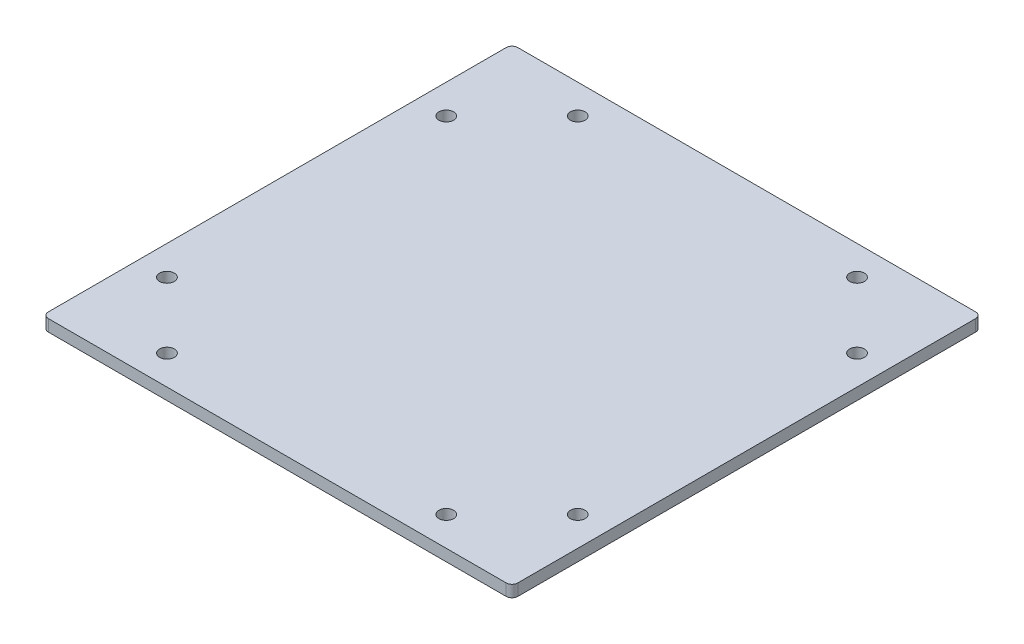
ISO-10303-21;
HEADER;
FILE_DESCRIPTION(('STEP AP214'),'2;1');
FILE_NAME('part.step','',(''),(''),'','','');
FILE_SCHEMA(('AUTOMOTIVE_DESIGN { 1 0 10303 214 1 1 1 1 }'));
ENDSEC;
DATA;
#1=APPLICATION_CONTEXT('core data for automotive mechanical design processes');
#2=APPLICATION_PROTOCOL_DEFINITION('international standard','automotive_design',2000,#1);
#3=PRODUCT_CONTEXT('',#1,'mechanical');
#4=PRODUCT('Part','Part','',(#3));
#5=PRODUCT_RELATED_PRODUCT_CATEGORY('part','',(#4));
#6=PRODUCT_DEFINITION_FORMATION('','',#4);
#7=PRODUCT_DEFINITION_CONTEXT('part definition',#1,'design');
#8=PRODUCT_DEFINITION('design','',#6,#7);
#9=PRODUCT_DEFINITION_SHAPE('','',#8);
#10=(LENGTH_UNIT() NAMED_UNIT(*) SI_UNIT(.MILLI.,.METRE.));
#11=(NAMED_UNIT(*) PLANE_ANGLE_UNIT() SI_UNIT($,.RADIAN.));
#12=(NAMED_UNIT(*) SI_UNIT($,.STERADIAN.) SOLID_ANGLE_UNIT());
#13=UNCERTAINTY_MEASURE_WITH_UNIT(LENGTH_MEASURE(1.E-05),#10,'distance_accuracy_value','');
#14=(GEOMETRIC_REPRESENTATION_CONTEXT(3) GLOBAL_UNCERTAINTY_ASSIGNED_CONTEXT((#13)) GLOBAL_UNIT_ASSIGNED_CONTEXT((#10,
#11,#12)) REPRESENTATION_CONTEXT('',''));
#15=CARTESIAN_POINT('',(0.,0.,0.));
#16=DIRECTION('',(0.,0.,1.));
#17=DIRECTION('',(1.,0.,0.));
#18=AXIS2_PLACEMENT_3D('',#15,#16,#17);
#19=CARTESIAN_POINT('',(-99.06,5.08,-99.06));
#20=DIRECTION('',(0.,-1.,0.));
#21=DIRECTION('',(0.,0.,-1.));
#22=AXIS2_PLACEMENT_3D('',#19,#20,#21);
#23=PLANE('',#22);
#24=CARTESIAN_POINT('',(60.452,5.08,88.9));
#25=DIRECTION('',(0.,1.,0.));
#26=DIRECTION('',(0.,0.,-1.));
#27=AXIS2_PLACEMENT_3D('',#24,#25,#26);
#28=CIRCLE('',#27,3.175);
#29=CARTESIAN_POINT('',(60.452,5.08,85.725));
#30=VERTEX_POINT('',#29);
#31=EDGE_CURVE('E212',#30,#30,#28,.T.);
#32=ORIENTED_EDGE('',*,*,#31,.F.);
#33=EDGE_LOOP('',(#32));
#34=FACE_BOUND('',#33,.T.);
#35=CARTESIAN_POINT('',(-60.452,5.08,-88.9));
#36=DIRECTION('',(0.,1.,0.));
#37=DIRECTION('',(0.,0.,-1.));
#38=AXIS2_PLACEMENT_3D('',#35,#36,#37);
#39=CIRCLE('',#38,3.175);
#40=CARTESIAN_POINT('',(-60.452,5.08,-92.075));
#41=VERTEX_POINT('',#40);
#42=EDGE_CURVE('E200',#41,#41,#39,.T.);
#43=ORIENTED_EDGE('',*,*,#42,.F.);
#44=EDGE_LOOP('',(#43));
#45=FACE_BOUND('',#44,.T.);
#46=CARTESIAN_POINT('',(88.9,5.08,-60.452));
#47=DIRECTION('',(0.,1.,0.));
#48=DIRECTION('',(0.,0.,-1.));
#49=AXIS2_PLACEMENT_3D('',#46,#47,#48);
#50=CIRCLE('',#49,3.175);
#51=CARTESIAN_POINT('',(88.9,5.08,-63.627));
#52=VERTEX_POINT('',#51);
#53=EDGE_CURVE('E188',#52,#52,#50,.T.);
#54=ORIENTED_EDGE('',*,*,#53,.F.);
#55=EDGE_LOOP('',(#54));
#56=FACE_BOUND('',#55,.T.);
#57=CARTESIAN_POINT('',(-60.452,5.08,88.9));
#58=DIRECTION('',(0.,1.,0.));
#59=DIRECTION('',(0.,0.,1.));
#60=AXIS2_PLACEMENT_3D('',#57,#58,#59);
#61=CIRCLE('',#60,3.175);
#62=CARTESIAN_POINT('',(-60.452,5.08,92.075));
#63=VERTEX_POINT('',#62);
#64=EDGE_CURVE('E134',#63,#63,#61,.T.);
#65=ORIENTED_EDGE('',*,*,#64,.F.);
#66=EDGE_LOOP('',(#65));
#67=FACE_BOUND('',#66,.T.);
#68=CARTESIAN_POINT('',(-99.06,5.08,-99.06));
#69=DIRECTION('',(0.,1.,0.));
#70=DIRECTION('',(0.,0.,-1.));
#71=AXIS2_PLACEMENT_3D('',#68,#69,#70);
#72=CIRCLE('',#71,2.54);
#73=CARTESIAN_POINT('',(-99.06,5.08,-101.6));
#74=VERTEX_POINT('',#73);
#75=CARTESIAN_POINT('',(-101.6,5.08,-99.06));
#76=VERTEX_POINT('',#75);
#77=EDGE_CURVE('E145',#74,#76,#72,.T.);
#78=ORIENTED_EDGE('',*,*,#77,.T.);
#79=DIRECTION('',(0.,0.,1.));
#80=VECTOR('',#79,1.);
#81=CARTESIAN_POINT('',(-101.6,5.08,99.06));
#82=LINE('',#81,#80);
#83=CARTESIAN_POINT('',(-101.6,5.08,99.06));
#84=VERTEX_POINT('',#83);
#85=EDGE_CURVE('E93',#76,#84,#82,.T.);
#86=ORIENTED_EDGE('',*,*,#85,.T.);
#87=CARTESIAN_POINT('',(-99.06,5.08,99.06));
#88=DIRECTION('',(0.,1.,0.));
#89=DIRECTION('',(0.,0.,-1.));
#90=AXIS2_PLACEMENT_3D('',#87,#88,#89);
#91=CIRCLE('',#90,2.54);
#92=CARTESIAN_POINT('',(-99.06,5.08,101.6));
#93=VERTEX_POINT('',#92);
#94=EDGE_CURVE('E160',#84,#93,#91,.T.);
#95=ORIENTED_EDGE('',*,*,#94,.T.);
#96=DIRECTION('',(1.,0.,0.));
#97=VECTOR('',#96,1.);
#98=CARTESIAN_POINT('',(-99.06,5.08,101.6));
#99=LINE('',#98,#97);
#100=CARTESIAN_POINT('',(99.06,5.08,101.6));
#101=VERTEX_POINT('',#100);
#102=EDGE_CURVE('E173',#93,#101,#99,.T.);
#103=ORIENTED_EDGE('',*,*,#102,.T.);
#104=CARTESIAN_POINT('',(99.06,5.08,99.06));
#105=DIRECTION('',(0.,1.,0.));
#106=DIRECTION('',(0.,0.,1.));
#107=AXIS2_PLACEMENT_3D('',#104,#105,#106);
#108=CIRCLE('',#107,2.54);
#109=CARTESIAN_POINT('',(101.6,5.08,99.06));
#110=VERTEX_POINT('',#109);
#111=EDGE_CURVE('E112',#101,#110,#108,.T.);
#112=ORIENTED_EDGE('',*,*,#111,.T.);
#113=DIRECTION('',(0.,0.,-1.));
#114=VECTOR('',#113,1.);
#115=CARTESIAN_POINT('',(101.6,5.08,99.06));
#116=LINE('',#115,#114);
#117=CARTESIAN_POINT('',(101.6,5.08,-99.06));
#118=VERTEX_POINT('',#117);
#119=EDGE_CURVE('E106',#110,#118,#116,.T.);
#120=ORIENTED_EDGE('',*,*,#119,.T.);
#121=CARTESIAN_POINT('',(99.06,5.08,-99.06));
#122=DIRECTION('',(0.,1.,0.));
#123=DIRECTION('',(0.,0.,-1.));
#124=AXIS2_PLACEMENT_3D('',#121,#122,#123);
#125=CIRCLE('',#124,2.54);
#126=CARTESIAN_POINT('',(99.06,5.08,-101.6));
#127=VERTEX_POINT('',#126);
#128=EDGE_CURVE('E110',#118,#127,#125,.T.);
#129=ORIENTED_EDGE('',*,*,#128,.T.);
#130=DIRECTION('',(-1.,0.,0.));
#131=VECTOR('',#130,1.);
#132=CARTESIAN_POINT('',(-99.06,5.08,-101.6));
#133=LINE('',#132,#131);
#134=EDGE_CURVE('E50',#127,#74,#133,.T.);
#135=ORIENTED_EDGE('',*,*,#134,.T.);
#136=EDGE_LOOP('',(#78,#86,#95,#103,#112,#120,#129,#135));
#137=FACE_BOUND('',#136,.T.);
#138=CARTESIAN_POINT('',(-88.9,5.08,60.452));
#139=DIRECTION('',(0.,1.,0.));
#140=DIRECTION('',(0.,0.,-1.));
#141=AXIS2_PLACEMENT_3D('',#138,#139,#140);
#142=CIRCLE('',#141,3.175);
#143=CARTESIAN_POINT('',(-88.9,5.08,57.277));
#144=VERTEX_POINT('',#143);
#145=EDGE_CURVE('E182',#144,#144,#142,.T.);
#146=ORIENTED_EDGE('',*,*,#145,.F.);
#147=EDGE_LOOP('',(#146));
#148=FACE_BOUND('',#147,.T.);
#149=CARTESIAN_POINT('',(60.452,5.08,-88.9));
#150=DIRECTION('',(0.,1.,0.));
#151=DIRECTION('',(0.,0.,1.));
#152=AXIS2_PLACEMENT_3D('',#149,#150,#151);
#153=CIRCLE('',#152,3.175);
#154=CARTESIAN_POINT('',(60.452,5.08,-85.725));
#155=VERTEX_POINT('',#154);
#156=EDGE_CURVE('E194',#155,#155,#153,.T.);
#157=ORIENTED_EDGE('',*,*,#156,.F.);
#158=EDGE_LOOP('',(#157));
#159=FACE_BOUND('',#158,.T.);
#160=CARTESIAN_POINT('',(-88.9,5.08,-60.452));
#161=DIRECTION('',(0.,1.,0.));
#162=DIRECTION('',(0.,0.,1.));
#163=AXIS2_PLACEMENT_3D('',#160,#161,#162);
#164=CIRCLE('',#163,3.175);
#165=CARTESIAN_POINT('',(-88.9,5.08,-57.277));
#166=VERTEX_POINT('',#165);
#167=EDGE_CURVE('E206',#166,#166,#164,.T.);
#168=ORIENTED_EDGE('',*,*,#167,.F.);
#169=EDGE_LOOP('',(#168));
#170=FACE_BOUND('',#169,.T.);
#171=CARTESIAN_POINT('',(88.9,5.08,60.452));
#172=DIRECTION('',(0.,1.,0.));
#173=DIRECTION('',(0.,0.,1.));
#174=AXIS2_PLACEMENT_3D('',#171,#172,#173);
#175=CIRCLE('',#174,3.175);
#176=CARTESIAN_POINT('',(88.9,5.08,63.627));
#177=VERTEX_POINT('',#176);
#178=EDGE_CURVE('E218',#177,#177,#175,.T.);
#179=ORIENTED_EDGE('',*,*,#178,.F.);
#180=EDGE_LOOP('',(#179));
#181=FACE_BOUND('',#180,.T.);
#182=ADVANCED_FACE('F33',(#34,#45,#56,#67,#137,#148,#159,#170,#181),#23,.F.);
#183=CARTESIAN_POINT('',(-99.06,0.,-99.06));
#184=DIRECTION('',(0.,-1.,0.));
#185=DIRECTION('',(0.,0.,-1.));
#186=AXIS2_PLACEMENT_3D('',#183,#184,#185);
#187=PLANE('',#186);
#188=CARTESIAN_POINT('',(60.452,0.,88.9));
#189=DIRECTION('',(0.,1.,0.));
#190=DIRECTION('',(0.,0.,-1.));
#191=AXIS2_PLACEMENT_3D('',#188,#189,#190);
#192=CIRCLE('',#191,3.175);
#193=CARTESIAN_POINT('',(60.452,0.,85.725));
#194=VERTEX_POINT('',#193);
#195=EDGE_CURVE('E215',#194,#194,#192,.T.);
#196=ORIENTED_EDGE('',*,*,#195,.T.);
#197=EDGE_LOOP('',(#196));
#198=FACE_BOUND('',#197,.T.);
#199=CARTESIAN_POINT('',(-60.452,0.,-88.9));
#200=DIRECTION('',(0.,1.,0.));
#201=DIRECTION('',(0.,0.,-1.));
#202=AXIS2_PLACEMENT_3D('',#199,#200,#201);
#203=CIRCLE('',#202,3.175);
#204=CARTESIAN_POINT('',(-60.452,0.,-92.075));
#205=VERTEX_POINT('',#204);
#206=EDGE_CURVE('E203',#205,#205,#203,.T.);
#207=ORIENTED_EDGE('',*,*,#206,.T.);
#208=EDGE_LOOP('',(#207));
#209=FACE_BOUND('',#208,.T.);
#210=CARTESIAN_POINT('',(88.9,0.,-60.452));
#211=DIRECTION('',(0.,1.,0.));
#212=DIRECTION('',(0.,0.,-1.));
#213=AXIS2_PLACEMENT_3D('',#210,#211,#212);
#214=CIRCLE('',#213,3.175);
#215=CARTESIAN_POINT('',(88.9,0.,-63.627));
#216=VERTEX_POINT('',#215);
#217=EDGE_CURVE('E191',#216,#216,#214,.T.);
#218=ORIENTED_EDGE('',*,*,#217,.T.);
#219=EDGE_LOOP('',(#218));
#220=FACE_BOUND('',#219,.T.);
#221=CARTESIAN_POINT('',(-60.452,0.,88.9));
#222=DIRECTION('',(0.,1.,0.));
#223=DIRECTION('',(0.,0.,1.));
#224=AXIS2_PLACEMENT_3D('',#221,#222,#223);
#225=CIRCLE('',#224,3.175);
#226=CARTESIAN_POINT('',(-60.452,0.,92.075));
#227=VERTEX_POINT('',#226);
#228=EDGE_CURVE('E179',#227,#227,#225,.T.);
#229=ORIENTED_EDGE('',*,*,#228,.T.);
#230=EDGE_LOOP('',(#229));
#231=FACE_BOUND('',#230,.T.);
#232=CARTESIAN_POINT('',(-99.06,0.,-99.06));
#233=DIRECTION('',(0.,1.,0.));
#234=DIRECTION('',(0.,0.,-1.));
#235=AXIS2_PLACEMENT_3D('',#232,#233,#234);
#236=CIRCLE('',#235,2.54);
#237=CARTESIAN_POINT('',(-99.06,0.,-101.6));
#238=VERTEX_POINT('',#237);
#239=CARTESIAN_POINT('',(-101.6,0.,-99.06));
#240=VERTEX_POINT('',#239);
#241=EDGE_CURVE('E130',#238,#240,#236,.T.);
#242=ORIENTED_EDGE('',*,*,#241,.F.);
#243=DIRECTION('',(-1.,0.,0.));
#244=VECTOR('',#243,1.);
#245=CARTESIAN_POINT('',(-99.06,0.,-101.6));
#246=LINE('',#245,#244);
#247=CARTESIAN_POINT('',(99.06,0.,-101.6));
#248=VERTEX_POINT('',#247);
#249=EDGE_CURVE('E85',#248,#238,#246,.T.);
#250=ORIENTED_EDGE('',*,*,#249,.F.);
#251=CARTESIAN_POINT('',(99.06,0.,-99.06));
#252=DIRECTION('',(0.,1.,0.));
#253=DIRECTION('',(0.,0.,-1.));
#254=AXIS2_PLACEMENT_3D('',#251,#252,#253);
#255=CIRCLE('',#254,2.54);
#256=CARTESIAN_POINT('',(101.6,0.,-99.06));
#257=VERTEX_POINT('',#256);
#258=EDGE_CURVE('E79',#257,#248,#255,.T.);
#259=ORIENTED_EDGE('',*,*,#258,.F.);
#260=DIRECTION('',(0.,0.,-1.));
#261=VECTOR('',#260,1.);
#262=CARTESIAN_POINT('',(101.6,0.,99.06));
#263=LINE('',#262,#261);
#264=CARTESIAN_POINT('',(101.6,0.,99.06));
#265=VERTEX_POINT('',#264);
#266=EDGE_CURVE('E120',#265,#257,#263,.T.);
#267=ORIENTED_EDGE('',*,*,#266,.F.);
#268=CARTESIAN_POINT('',(99.06,0.,99.06));
#269=DIRECTION('',(0.,1.,0.));
#270=DIRECTION('',(0.,0.,1.));
#271=AXIS2_PLACEMENT_3D('',#268,#269,#270);
#272=CIRCLE('',#271,2.54);
#273=CARTESIAN_POINT('',(99.06,0.,101.6));
#274=VERTEX_POINT('',#273);
#275=EDGE_CURVE('E140',#274,#265,#272,.T.);
#276=ORIENTED_EDGE('',*,*,#275,.F.);
#277=DIRECTION('',(1.,0.,0.));
#278=VECTOR('',#277,1.);
#279=CARTESIAN_POINT('',(-99.06,0.,101.6));
#280=LINE('',#279,#278);
#281=CARTESIAN_POINT('',(-99.06,0.,101.6));
#282=VERTEX_POINT('',#281);
#283=EDGE_CURVE('E138',#282,#274,#280,.T.);
#284=ORIENTED_EDGE('',*,*,#283,.F.);
#285=CARTESIAN_POINT('',(-99.06,0.,99.06));
#286=DIRECTION('',(0.,1.,0.));
#287=DIRECTION('',(0.,0.,-1.));
#288=AXIS2_PLACEMENT_3D('',#285,#286,#287);
#289=CIRCLE('',#288,2.54);
#290=CARTESIAN_POINT('',(-101.6,0.,99.06));
#291=VERTEX_POINT('',#290);
#292=EDGE_CURVE('E136',#291,#282,#289,.T.);
#293=ORIENTED_EDGE('',*,*,#292,.F.);
#294=DIRECTION('',(0.,0.,1.));
#295=VECTOR('',#294,1.);
#296=CARTESIAN_POINT('',(-101.6,0.,99.06));
#297=LINE('',#296,#295);
#298=EDGE_CURVE('E133',#240,#291,#297,.T.);
#299=ORIENTED_EDGE('',*,*,#298,.F.);
#300=EDGE_LOOP('',(#242,#250,#259,#267,#276,#284,#293,#299));
#301=FACE_BOUND('',#300,.T.);
#302=CARTESIAN_POINT('',(-88.9,0.,60.452));
#303=DIRECTION('',(0.,1.,0.));
#304=DIRECTION('',(0.,0.,-1.));
#305=AXIS2_PLACEMENT_3D('',#302,#303,#304);
#306=CIRCLE('',#305,3.175);
#307=CARTESIAN_POINT('',(-88.9,0.,57.277));
#308=VERTEX_POINT('',#307);
#309=EDGE_CURVE('E185',#308,#308,#306,.T.);
#310=ORIENTED_EDGE('',*,*,#309,.T.);
#311=EDGE_LOOP('',(#310));
#312=FACE_BOUND('',#311,.T.);
#313=CARTESIAN_POINT('',(60.452,0.,-88.9));
#314=DIRECTION('',(0.,1.,0.));
#315=DIRECTION('',(0.,0.,1.));
#316=AXIS2_PLACEMENT_3D('',#313,#314,#315);
#317=CIRCLE('',#316,3.175);
#318=CARTESIAN_POINT('',(60.452,0.,-85.725));
#319=VERTEX_POINT('',#318);
#320=EDGE_CURVE('E197',#319,#319,#317,.T.);
#321=ORIENTED_EDGE('',*,*,#320,.T.);
#322=EDGE_LOOP('',(#321));
#323=FACE_BOUND('',#322,.T.);
#324=CARTESIAN_POINT('',(-88.9,0.,-60.452));
#325=DIRECTION('',(0.,1.,0.));
#326=DIRECTION('',(0.,0.,1.));
#327=AXIS2_PLACEMENT_3D('',#324,#325,#326);
#328=CIRCLE('',#327,3.175);
#329=CARTESIAN_POINT('',(-88.9,0.,-57.277));
#330=VERTEX_POINT('',#329);
#331=EDGE_CURVE('E209',#330,#330,#328,.T.);
#332=ORIENTED_EDGE('',*,*,#331,.T.);
#333=EDGE_LOOP('',(#332));
#334=FACE_BOUND('',#333,.T.);
#335=CARTESIAN_POINT('',(88.9,0.,60.452));
#336=DIRECTION('',(0.,1.,0.));
#337=DIRECTION('',(0.,0.,1.));
#338=AXIS2_PLACEMENT_3D('',#335,#336,#337);
#339=CIRCLE('',#338,3.175);
#340=CARTESIAN_POINT('',(88.9,0.,63.627));
#341=VERTEX_POINT('',#340);
#342=EDGE_CURVE('E221',#341,#341,#339,.T.);
#343=ORIENTED_EDGE('',*,*,#342,.T.);
#344=EDGE_LOOP('',(#343));
#345=FACE_BOUND('',#344,.T.);
#346=ADVANCED_FACE('F164',(#198,#209,#220,#231,#301,#312,#323,#334,#345),#187,.T.);
#347=CARTESIAN_POINT('',(-99.06,5.08,-99.06));
#348=DIRECTION('',(0.,-1.,0.));
#349=DIRECTION('',(0.,0.,-1.));
#350=AXIS2_PLACEMENT_3D('',#347,#348,#349);
#351=CYLINDRICAL_SURFACE('',#350,2.54);
#352=ORIENTED_EDGE('',*,*,#241,.T.);
#353=DIRECTION('',(0.,-1.,0.));
#354=VECTOR('',#353,1.);
#355=CARTESIAN_POINT('',(-101.6,5.08,-99.06));
#356=LINE('',#355,#354);
#357=EDGE_CURVE('E11',#76,#240,#356,.T.);
#358=ORIENTED_EDGE('',*,*,#357,.F.);
#359=ORIENTED_EDGE('',*,*,#77,.F.);
#360=DIRECTION('',(0.,-1.,0.));
#361=VECTOR('',#360,1.);
#362=CARTESIAN_POINT('',(-99.06,5.08,-101.6));
#363=LINE('',#362,#361);
#364=EDGE_CURVE('E126',#74,#238,#363,.T.);
#365=ORIENTED_EDGE('',*,*,#364,.T.);
#366=EDGE_LOOP('',(#352,#358,#359,#365));
#367=FACE_BOUND('',#366,.T.);
#368=ADVANCED_FACE('F35',(#367),#351,.T.);
#369=CARTESIAN_POINT('',(-101.6,5.08,99.06));
#370=DIRECTION('',(1.,0.,0.));
#371=DIRECTION('',(0.,0.,-1.));
#372=AXIS2_PLACEMENT_3D('',#369,#370,#371);
#373=PLANE('',#372);
#374=ORIENTED_EDGE('',*,*,#298,.T.);
#375=DIRECTION('',(0.,-1.,0.));
#376=VECTOR('',#375,1.);
#377=CARTESIAN_POINT('',(-101.6,5.08,99.06));
#378=LINE('',#377,#376);
#379=EDGE_CURVE('E42',#84,#291,#378,.T.);
#380=ORIENTED_EDGE('',*,*,#379,.F.);
#381=ORIENTED_EDGE('',*,*,#85,.F.);
#382=ORIENTED_EDGE('',*,*,#357,.T.);
#383=EDGE_LOOP('',(#374,#380,#381,#382));
#384=FACE_BOUND('',#383,.T.);
#385=ADVANCED_FACE('F256',(#384),#373,.F.);
#386=CARTESIAN_POINT('',(-99.06,5.08,99.06));
#387=DIRECTION('',(0.,-1.,0.));
#388=DIRECTION('',(0.,0.,-1.));
#389=AXIS2_PLACEMENT_3D('',#386,#387,#388);
#390=CYLINDRICAL_SURFACE('',#389,2.54);
#391=ORIENTED_EDGE('',*,*,#292,.T.);
#392=DIRECTION('',(0.,-1.,0.));
#393=VECTOR('',#392,1.);
#394=CARTESIAN_POINT('',(-99.06,5.08,101.6));
#395=LINE('',#394,#393);
#396=EDGE_CURVE('E152',#93,#282,#395,.T.);
#397=ORIENTED_EDGE('',*,*,#396,.F.);
#398=ORIENTED_EDGE('',*,*,#94,.F.);
#399=ORIENTED_EDGE('',*,*,#379,.T.);
#400=EDGE_LOOP('',(#391,#397,#398,#399));
#401=FACE_BOUND('',#400,.T.);
#402=ADVANCED_FACE('F158',(#401),#390,.T.);
#403=CARTESIAN_POINT('',(-99.06,5.08,101.6));
#404=DIRECTION('',(0.,0.,-1.));
#405=DIRECTION('',(-1.,0.,0.));
#406=AXIS2_PLACEMENT_3D('',#403,#404,#405);
#407=PLANE('',#406);
#408=ORIENTED_EDGE('',*,*,#283,.T.);
#409=DIRECTION('',(0.,-1.,0.));
#410=VECTOR('',#409,1.);
#411=CARTESIAN_POINT('',(99.06,5.08,101.6));
#412=LINE('',#411,#410);
#413=EDGE_CURVE('E149',#101,#274,#412,.T.);
#414=ORIENTED_EDGE('',*,*,#413,.F.);
#415=ORIENTED_EDGE('',*,*,#102,.F.);
#416=ORIENTED_EDGE('',*,*,#396,.T.);
#417=EDGE_LOOP('',(#408,#414,#415,#416));
#418=FACE_BOUND('',#417,.T.);
#419=ADVANCED_FACE('F169',(#418),#407,.F.);
#420=CARTESIAN_POINT('',(99.06,5.08,99.06));
#421=DIRECTION('',(0.,-1.,0.));
#422=DIRECTION('',(0.,0.,-1.));
#423=AXIS2_PLACEMENT_3D('',#420,#421,#422);
#424=CYLINDRICAL_SURFACE('',#423,2.54);
#425=ORIENTED_EDGE('',*,*,#275,.T.);
#426=DIRECTION('',(0.,-1.,0.));
#427=VECTOR('',#426,1.);
#428=CARTESIAN_POINT('',(101.6,5.08,99.06));
#429=LINE('',#428,#427);
#430=EDGE_CURVE('E121',#110,#265,#429,.T.);
#431=ORIENTED_EDGE('',*,*,#430,.F.);
#432=ORIENTED_EDGE('',*,*,#111,.F.);
#433=ORIENTED_EDGE('',*,*,#413,.T.);
#434=EDGE_LOOP('',(#425,#431,#432,#433));
#435=FACE_BOUND('',#434,.T.);
#436=ADVANCED_FACE('F172',(#435),#424,.T.);
#437=CARTESIAN_POINT('',(101.6,5.08,99.06));
#438=DIRECTION('',(-1.,0.,0.));
#439=DIRECTION('',(0.,0.,1.));
#440=AXIS2_PLACEMENT_3D('',#437,#438,#439);
#441=PLANE('',#440);
#442=ORIENTED_EDGE('',*,*,#266,.T.);
#443=DIRECTION('',(0.,-1.,0.));
#444=VECTOR('',#443,1.);
#445=CARTESIAN_POINT('',(101.6,5.08,-99.06));
#446=LINE('',#445,#444);
#447=EDGE_CURVE('E117',#118,#257,#446,.T.);
#448=ORIENTED_EDGE('',*,*,#447,.F.);
#449=ORIENTED_EDGE('',*,*,#119,.F.);
#450=ORIENTED_EDGE('',*,*,#430,.T.);
#451=EDGE_LOOP('',(#442,#448,#449,#450));
#452=FACE_BOUND('',#451,.T.);
#453=ADVANCED_FACE('F118',(#452),#441,.F.);
#454=CARTESIAN_POINT('',(99.06,5.08,-99.06));
#455=DIRECTION('',(0.,-1.,0.));
#456=DIRECTION('',(0.,0.,-1.));
#457=AXIS2_PLACEMENT_3D('',#454,#455,#456);
#458=CYLINDRICAL_SURFACE('',#457,2.54);
#459=ORIENTED_EDGE('',*,*,#258,.T.);
#460=DIRECTION('',(0.,-1.,0.));
#461=VECTOR('',#460,1.);
#462=CARTESIAN_POINT('',(99.06,5.08,-101.6));
#463=LINE('',#462,#461);
#464=EDGE_CURVE('E122',#127,#248,#463,.T.);
#465=ORIENTED_EDGE('',*,*,#464,.F.);
#466=ORIENTED_EDGE('',*,*,#128,.F.);
#467=ORIENTED_EDGE('',*,*,#447,.T.);
#468=EDGE_LOOP('',(#459,#465,#466,#467));
#469=FACE_BOUND('',#468,.T.);
#470=ADVANCED_FACE('F124',(#469),#458,.T.);
#471=CARTESIAN_POINT('',(-99.06,5.08,-101.6));
#472=DIRECTION('',(0.,0.,1.));
#473=DIRECTION('',(1.,0.,0.));
#474=AXIS2_PLACEMENT_3D('',#471,#472,#473);
#475=PLANE('',#474);
#476=ORIENTED_EDGE('',*,*,#249,.T.);
#477=ORIENTED_EDGE('',*,*,#364,.F.);
#478=ORIENTED_EDGE('',*,*,#134,.F.);
#479=ORIENTED_EDGE('',*,*,#464,.T.);
#480=EDGE_LOOP('',(#476,#477,#478,#479));
#481=FACE_BOUND('',#480,.T.);
#482=ADVANCED_FACE('F244',(#481),#475,.F.);
#483=CARTESIAN_POINT('',(-60.452,5.08,88.9));
#484=DIRECTION('',(0.,-1.,0.));
#485=DIRECTION('',(0.,0.,-1.));
#486=AXIS2_PLACEMENT_3D('',#483,#484,#485);
#487=CYLINDRICAL_SURFACE('',#486,3.175);
#488=ORIENTED_EDGE('',*,*,#64,.T.);
#489=EDGE_LOOP('',(#488));
#490=FACE_BOUND('',#489,.T.);
#491=ORIENTED_EDGE('',*,*,#228,.F.);
#492=EDGE_LOOP('',(#491));
#493=FACE_BOUND('',#492,.T.);
#494=ADVANCED_FACE('F241',(#490,#493),#487,.F.);
#495=CARTESIAN_POINT('',(-88.9,5.08,60.452));
#496=DIRECTION('',(0.,-1.,0.));
#497=DIRECTION('',(0.,0.,-1.));
#498=AXIS2_PLACEMENT_3D('',#495,#496,#497);
#499=CYLINDRICAL_SURFACE('',#498,3.175);
#500=ORIENTED_EDGE('',*,*,#145,.T.);
#501=EDGE_LOOP('',(#500));
#502=FACE_BOUND('',#501,.T.);
#503=ORIENTED_EDGE('',*,*,#309,.F.);
#504=EDGE_LOOP('',(#503));
#505=FACE_BOUND('',#504,.T.);
#506=ADVANCED_FACE('F320',(#502,#505),#499,.F.);
#507=CARTESIAN_POINT('',(88.9,5.08,-60.452));
#508=DIRECTION('',(0.,-1.,0.));
#509=DIRECTION('',(0.,0.,-1.));
#510=AXIS2_PLACEMENT_3D('',#507,#508,#509);
#511=CYLINDRICAL_SURFACE('',#510,3.175);
#512=ORIENTED_EDGE('',*,*,#53,.T.);
#513=EDGE_LOOP('',(#512));
#514=FACE_BOUND('',#513,.T.);
#515=ORIENTED_EDGE('',*,*,#217,.F.);
#516=EDGE_LOOP('',(#515));
#517=FACE_BOUND('',#516,.T.);
#518=ADVANCED_FACE('F328',(#514,#517),#511,.F.);
#519=CARTESIAN_POINT('',(60.452,5.08,-88.9));
#520=DIRECTION('',(0.,-1.,0.));
#521=DIRECTION('',(0.,0.,-1.));
#522=AXIS2_PLACEMENT_3D('',#519,#520,#521);
#523=CYLINDRICAL_SURFACE('',#522,3.175);
#524=ORIENTED_EDGE('',*,*,#156,.T.);
#525=EDGE_LOOP('',(#524));
#526=FACE_BOUND('',#525,.T.);
#527=ORIENTED_EDGE('',*,*,#320,.F.);
#528=EDGE_LOOP('',(#527));
#529=FACE_BOUND('',#528,.T.);
#530=ADVANCED_FACE('F336',(#526,#529),#523,.F.);
#531=CARTESIAN_POINT('',(-60.452,5.08,-88.9));
#532=DIRECTION('',(0.,-1.,0.));
#533=DIRECTION('',(0.,0.,-1.));
#534=AXIS2_PLACEMENT_3D('',#531,#532,#533);
#535=CYLINDRICAL_SURFACE('',#534,3.175);
#536=ORIENTED_EDGE('',*,*,#42,.T.);
#537=EDGE_LOOP('',(#536));
#538=FACE_BOUND('',#537,.T.);
#539=ORIENTED_EDGE('',*,*,#206,.F.);
#540=EDGE_LOOP('',(#539));
#541=FACE_BOUND('',#540,.T.);
#542=ADVANCED_FACE('F345',(#538,#541),#535,.F.);
#543=CARTESIAN_POINT('',(-88.9,5.08,-60.452));
#544=DIRECTION('',(0.,-1.,0.));
#545=DIRECTION('',(0.,0.,-1.));
#546=AXIS2_PLACEMENT_3D('',#543,#544,#545);
#547=CYLINDRICAL_SURFACE('',#546,3.175);
#548=ORIENTED_EDGE('',*,*,#167,.T.);
#549=EDGE_LOOP('',(#548));
#550=FACE_BOUND('',#549,.T.);
#551=ORIENTED_EDGE('',*,*,#331,.F.);
#552=EDGE_LOOP('',(#551));
#553=FACE_BOUND('',#552,.T.);
#554=ADVANCED_FACE('F354',(#550,#553),#547,.F.);
#555=CARTESIAN_POINT('',(60.452,5.08,88.9));
#556=DIRECTION('',(0.,-1.,0.));
#557=DIRECTION('',(0.,0.,-1.));
#558=AXIS2_PLACEMENT_3D('',#555,#556,#557);
#559=CYLINDRICAL_SURFACE('',#558,3.175);
#560=ORIENTED_EDGE('',*,*,#31,.T.);
#561=EDGE_LOOP('',(#560));
#562=FACE_BOUND('',#561,.T.);
#563=ORIENTED_EDGE('',*,*,#195,.F.);
#564=EDGE_LOOP('',(#563));
#565=FACE_BOUND('',#564,.T.);
#566=ADVANCED_FACE('F363',(#562,#565),#559,.F.);
#567=CARTESIAN_POINT('',(88.9,5.08,60.452));
#568=DIRECTION('',(0.,-1.,0.));
#569=DIRECTION('',(0.,0.,-1.));
#570=AXIS2_PLACEMENT_3D('',#567,#568,#569);
#571=CYLINDRICAL_SURFACE('',#570,3.175);
#572=ORIENTED_EDGE('',*,*,#178,.T.);
#573=EDGE_LOOP('',(#572));
#574=FACE_BOUND('',#573,.T.);
#575=ORIENTED_EDGE('',*,*,#342,.F.);
#576=EDGE_LOOP('',(#575));
#577=FACE_BOUND('',#576,.T.);
#578=ADVANCED_FACE('F227',(#574,#577),#571,.F.);
#579=CLOSED_SHELL('',(#182,#346,#368,#385,#402,#419,#436,#453,#470,#482,#494,#506,#518,#530,
#542,#554,#566,#578));
#580=MANIFOLD_SOLID_BREP('B2',#579);
#581=ADVANCED_BREP_SHAPE_REPRESENTATION('',(#18,#580),#14);
#582=SHAPE_DEFINITION_REPRESENTATION(#9,#581);
ENDSEC;
END-ISO-10303-21;
